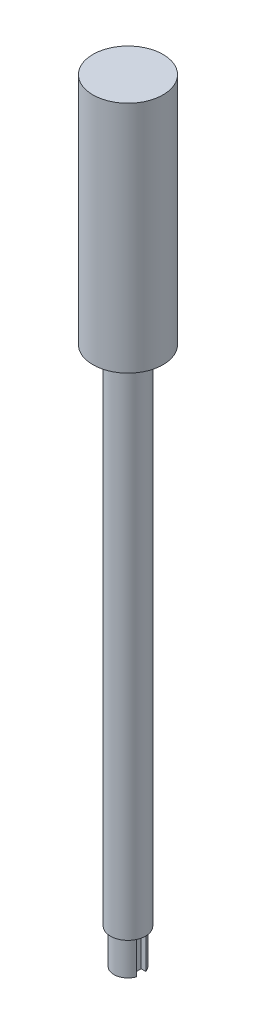
ISO-10303-21;
HEADER;
FILE_DESCRIPTION(('STEP AP214'),'2;1');
FILE_NAME('part.step','',(''),(''),'','','');
FILE_SCHEMA(('AUTOMOTIVE_DESIGN { 1 0 10303 214 1 1 1 1 }'));
ENDSEC;
DATA;
#1=APPLICATION_CONTEXT('core data for automotive mechanical design processes');
#2=APPLICATION_PROTOCOL_DEFINITION('international standard','automotive_design',2000,#1);
#3=PRODUCT_CONTEXT('',#1,'mechanical');
#4=PRODUCT('Part','Part','',(#3));
#5=PRODUCT_RELATED_PRODUCT_CATEGORY('part','',(#4));
#6=PRODUCT_DEFINITION_FORMATION('','',#4);
#7=PRODUCT_DEFINITION_CONTEXT('part definition',#1,'design');
#8=PRODUCT_DEFINITION('design','',#6,#7);
#9=PRODUCT_DEFINITION_SHAPE('','',#8);
#10=(LENGTH_UNIT() NAMED_UNIT(*) SI_UNIT(.MILLI.,.METRE.));
#11=(NAMED_UNIT(*) PLANE_ANGLE_UNIT() SI_UNIT($,.RADIAN.));
#12=(NAMED_UNIT(*) SI_UNIT($,.STERADIAN.) SOLID_ANGLE_UNIT());
#13=UNCERTAINTY_MEASURE_WITH_UNIT(LENGTH_MEASURE(1.E-05),#10,'distance_accuracy_value','');
#14=(GEOMETRIC_REPRESENTATION_CONTEXT(3) GLOBAL_UNCERTAINTY_ASSIGNED_CONTEXT((#13)) GLOBAL_UNIT_ASSIGNED_CONTEXT((#10,
#11,#12)) REPRESENTATION_CONTEXT('',''));
#15=CARTESIAN_POINT('',(0.,0.,0.));
#16=DIRECTION('',(0.,0.,1.));
#17=DIRECTION('',(1.,0.,0.));
#18=AXIS2_PLACEMENT_3D('',#15,#16,#17);
#19=CARTESIAN_POINT('',(0.,215.44,0.));
#20=DIRECTION('',(0.,-1.,0.));
#21=DIRECTION('',(0.,0.,-1.));
#22=AXIS2_PLACEMENT_3D('',#19,#20,#21);
#23=CYLINDRICAL_SURFACE('',#22,7.5);
#24=CARTESIAN_POINT('',(0.,213.44,0.));
#25=DIRECTION('',(0.,1.,0.));
#26=DIRECTION('',(0.,0.,1.));
#27=AXIS2_PLACEMENT_3D('',#24,#25,#26);
#28=CIRCLE('',#27,7.5);
#29=CARTESIAN_POINT('',(0.,213.44,7.5));
#30=VERTEX_POINT('',#29);
#31=EDGE_CURVE('E151',#30,#30,#28,.F.);
#32=ORIENTED_EDGE('',*,*,#31,.T.);
#33=EDGE_LOOP('',(#32));
#34=FACE_BOUND('',#33,.T.);
#35=CARTESIAN_POINT('',(0.,0.,0.));
#36=DIRECTION('',(0.,1.,0.));
#37=DIRECTION('',(0.,0.,1.));
#38=AXIS2_PLACEMENT_3D('',#35,#36,#37);
#39=CIRCLE('',#38,7.5);
#40=CARTESIAN_POINT('',(0.,0.,7.5));
#41=VERTEX_POINT('',#40);
#42=EDGE_CURVE('E139',#41,#41,#39,.T.);
#43=ORIENTED_EDGE('',*,*,#42,.T.);
#44=EDGE_LOOP('',(#43));
#45=FACE_BOUND('',#44,.T.);
#46=ADVANCED_FACE('F44',(#34,#45),#23,.T.);
#47=CARTESIAN_POINT('',(0.,0.,0.));
#48=DIRECTION('',(0.,1.,0.));
#49=DIRECTION('',(0.,0.,1.));
#50=AXIS2_PLACEMENT_3D('',#47,#48,#49);
#51=PLANE('',#50);
#52=DIRECTION('',(1.,0.,0.));
#53=VECTOR('',#52,1.);
#54=CARTESIAN_POINT('',(3.66,0.,-2.));
#55=LINE('',#54,#53);
#56=CARTESIAN_POINT('',(3.66,0.,-2.));
#57=VERTEX_POINT('',#56);
#58=CARTESIAN_POINT('',(5.65685424949238,0.,-2.));
#59=VERTEX_POINT('',#58);
#60=EDGE_CURVE('E89',#57,#59,#55,.T.);
#61=ORIENTED_EDGE('',*,*,#60,.T.);
#62=CARTESIAN_POINT('',(0.,0.,0.));
#63=DIRECTION('',(0.,1.,0.));
#64=DIRECTION('',(0.,0.,1.));
#65=AXIS2_PLACEMENT_3D('',#62,#63,#64);
#66=CIRCLE('',#65,6.);
#67=CARTESIAN_POINT('',(5.65685424949238,0.,2.));
#68=VERTEX_POINT('',#67);
#69=EDGE_CURVE('E54',#68,#59,#66,.F.);
#70=ORIENTED_EDGE('',*,*,#69,.F.);
#71=DIRECTION('',(-1.,0.,0.));
#72=VECTOR('',#71,1.);
#73=CARTESIAN_POINT('',(3.66,0.,2.));
#74=LINE('',#73,#72);
#75=CARTESIAN_POINT('',(3.66,0.,2.));
#76=VERTEX_POINT('',#75);
#77=EDGE_CURVE('E110',#68,#76,#74,.T.);
#78=ORIENTED_EDGE('',*,*,#77,.T.);
#79=DIRECTION('',(0.,0.,-1.));
#80=VECTOR('',#79,1.);
#81=CARTESIAN_POINT('',(3.66,0.,2.));
#82=LINE('',#81,#80);
#83=EDGE_CURVE('E93',#76,#57,#82,.T.);
#84=ORIENTED_EDGE('',*,*,#83,.T.);
#85=EDGE_LOOP('',(#61,#70,#78,#84));
#86=FACE_BOUND('',#85,.T.);
#87=ORIENTED_EDGE('',*,*,#42,.F.);
#88=EDGE_LOOP('',(#87));
#89=FACE_BOUND('',#88,.T.);
#90=ADVANCED_FACE('F161',(#86,#89),#51,.F.);
#91=CARTESIAN_POINT('',(0.,220.44,0.));
#92=DIRECTION('',(0.,-1.,0.));
#93=DIRECTION('',(0.,0.,-1.));
#94=AXIS2_PLACEMENT_3D('',#91,#92,#93);
#95=CYLINDRICAL_SURFACE('',#94,15.);
#96=CARTESIAN_POINT('',(0.,215.44,0.));
#97=DIRECTION('',(0.,1.,0.));
#98=DIRECTION('',(0.,0.,1.));
#99=AXIS2_PLACEMENT_3D('',#96,#97,#98);
#100=CIRCLE('',#99,15.);
#101=CARTESIAN_POINT('',(0.,215.44,15.));
#102=VERTEX_POINT('',#101);
#103=EDGE_CURVE('E135',#102,#102,#100,.T.);
#104=ORIENTED_EDGE('',*,*,#103,.T.);
#105=EDGE_LOOP('',(#104));
#106=FACE_BOUND('',#105,.T.);
#107=CARTESIAN_POINT('',(0.,315.44,0.));
#108=DIRECTION('',(0.,1.,0.));
#109=DIRECTION('',(0.,0.,1.));
#110=AXIS2_PLACEMENT_3D('',#107,#108,#109);
#111=CIRCLE('',#110,15.);
#112=CARTESIAN_POINT('',(0.,315.44,15.));
#113=VERTEX_POINT('',#112);
#114=EDGE_CURVE('E127',#113,#113,#111,.T.);
#115=ORIENTED_EDGE('',*,*,#114,.F.);
#116=EDGE_LOOP('',(#115));
#117=FACE_BOUND('',#116,.T.);
#118=ADVANCED_FACE('F178',(#106,#117),#95,.T.);
#119=CARTESIAN_POINT('',(0.,215.44,0.));
#120=DIRECTION('',(0.,1.,0.));
#121=DIRECTION('',(0.,0.,1.));
#122=AXIS2_PLACEMENT_3D('',#119,#120,#121);
#123=PLANE('',#122);
#124=CARTESIAN_POINT('',(0.,215.44,0.));
#125=DIRECTION('',(0.,1.,0.));
#126=DIRECTION('',(0.,0.,1.));
#127=AXIS2_PLACEMENT_3D('',#124,#125,#126);
#128=CIRCLE('',#127,9.5);
#129=CARTESIAN_POINT('',(0.,215.44,9.5));
#130=VERTEX_POINT('',#129);
#131=EDGE_CURVE('E147',#130,#130,#128,.T.);
#132=ORIENTED_EDGE('',*,*,#131,.T.);
#133=EDGE_LOOP('',(#132));
#134=FACE_BOUND('',#133,.T.);
#135=ORIENTED_EDGE('',*,*,#103,.F.);
#136=EDGE_LOOP('',(#135));
#137=FACE_BOUND('',#136,.T.);
#138=ADVANCED_FACE('F184',(#134,#137),#123,.F.);
#139=CARTESIAN_POINT('',(0.,315.44,0.));
#140=DIRECTION('',(0.,1.,0.));
#141=DIRECTION('',(0.,0.,1.));
#142=AXIS2_PLACEMENT_3D('',#139,#140,#141);
#143=PLANE('',#142);
#144=ORIENTED_EDGE('',*,*,#114,.T.);
#145=EDGE_LOOP('',(#144));
#146=FACE_BOUND('',#145,.T.);
#147=ADVANCED_FACE('F188',(#146),#143,.T.);
#148=CARTESIAN_POINT('',(0.,213.44,0.));
#149=DIRECTION('',(0.,1.,0.));
#150=DIRECTION('',(0.,0.,1.));
#151=AXIS2_PLACEMENT_3D('',#148,#149,#150);
#152=TOROIDAL_SURFACE('',#151,9.5,2.);
#153=ORIENTED_EDGE('',*,*,#31,.F.);
#154=EDGE_LOOP('',(#153));
#155=FACE_BOUND('',#154,.T.);
#156=ORIENTED_EDGE('',*,*,#131,.F.);
#157=EDGE_LOOP('',(#156));
#158=FACE_BOUND('',#157,.T.);
#159=ADVANCED_FACE('F46',(#155,#158),#152,.F.);
#160=CARTESIAN_POINT('',(0.,-15.,0.));
#161=DIRECTION('',(0.,1.,0.));
#162=DIRECTION('',(0.,0.,1.));
#163=AXIS2_PLACEMENT_3D('',#160,#161,#162);
#164=CYLINDRICAL_SURFACE('',#163,6.);
#165=ORIENTED_EDGE('',*,*,#69,.T.);
#166=DIRECTION('',(0.,1.,0.));
#167=VECTOR('',#166,1.);
#168=CARTESIAN_POINT('',(5.65685424949238,-15.,-2.));
#169=LINE('',#168,#167);
#170=CARTESIAN_POINT('',(5.65685424949238,-15.,-2.));
#171=VERTEX_POINT('',#170);
#172=EDGE_CURVE('E122',#59,#171,#169,.F.);
#173=ORIENTED_EDGE('',*,*,#172,.T.);
#174=CARTESIAN_POINT('',(0.,-15.,0.));
#175=DIRECTION('',(0.,-1.,0.));
#176=DIRECTION('',(0.,0.,-1.));
#177=AXIS2_PLACEMENT_3D('',#174,#175,#176);
#178=CIRCLE('',#177,6.);
#179=CARTESIAN_POINT('',(5.65685424949238,-15.,2.));
#180=VERTEX_POINT('',#179);
#181=EDGE_CURVE('E105',#180,#171,#178,.T.);
#182=ORIENTED_EDGE('',*,*,#181,.F.);
#183=DIRECTION('',(0.,1.,0.));
#184=VECTOR('',#183,1.);
#185=CARTESIAN_POINT('',(5.65685424949238,-15.,2.));
#186=LINE('',#185,#184);
#187=EDGE_CURVE('E92',#180,#68,#186,.T.);
#188=ORIENTED_EDGE('',*,*,#187,.T.);
#189=EDGE_LOOP('',(#165,#173,#182,#188));
#190=FACE_BOUND('',#189,.T.);
#191=ADVANCED_FACE('F159',(#190),#164,.T.);
#192=CARTESIAN_POINT('',(0.,-15.,0.));
#193=DIRECTION('',(0.,-1.,0.));
#194=DIRECTION('',(0.,0.,-1.));
#195=AXIS2_PLACEMENT_3D('',#192,#193,#194);
#196=PLANE('',#195);
#197=DIRECTION('',(1.,0.,0.));
#198=VECTOR('',#197,1.);
#199=CARTESIAN_POINT('',(3.66,-15.,-2.));
#200=LINE('',#199,#198);
#201=CARTESIAN_POINT('',(3.66,-15.,-2.));
#202=VERTEX_POINT('',#201);
#203=EDGE_CURVE('E68',#202,#171,#200,.T.);
#204=ORIENTED_EDGE('',*,*,#203,.F.);
#205=DIRECTION('',(0.,0.,-1.));
#206=VECTOR('',#205,1.);
#207=CARTESIAN_POINT('',(3.66,-15.,2.));
#208=LINE('',#207,#206);
#209=CARTESIAN_POINT('',(3.66,-15.,2.));
#210=VERTEX_POINT('',#209);
#211=EDGE_CURVE('E96',#210,#202,#208,.T.);
#212=ORIENTED_EDGE('',*,*,#211,.F.);
#213=DIRECTION('',(-1.,0.,0.));
#214=VECTOR('',#213,1.);
#215=CARTESIAN_POINT('',(0.,-15.,2.));
#216=LINE('',#215,#214);
#217=EDGE_CURVE('E11',#180,#210,#216,.T.);
#218=ORIENTED_EDGE('',*,*,#217,.F.);
#219=ORIENTED_EDGE('',*,*,#181,.T.);
#220=EDGE_LOOP('',(#204,#212,#218,#219));
#221=FACE_BOUND('',#220,.T.);
#222=ADVANCED_FACE('F103',(#221),#196,.T.);
#223=CARTESIAN_POINT('',(3.66,15.8077551029626,-2.));
#224=DIRECTION('',(0.,0.,-1.));
#225=DIRECTION('',(-1.,0.,0.));
#226=AXIS2_PLACEMENT_3D('',#223,#224,#225);
#227=PLANE('',#226);
#228=ORIENTED_EDGE('',*,*,#60,.F.);
#229=DIRECTION('',(0.,-1.,0.));
#230=VECTOR('',#229,1.);
#231=CARTESIAN_POINT('',(3.66,15.8077551029626,-2.));
#232=LINE('',#231,#230);
#233=EDGE_CURVE('E86',#57,#202,#232,.T.);
#234=ORIENTED_EDGE('',*,*,#233,.T.);
#235=ORIENTED_EDGE('',*,*,#203,.T.);
#236=ORIENTED_EDGE('',*,*,#172,.F.);
#237=EDGE_LOOP('',(#228,#234,#235,#236));
#238=FACE_BOUND('',#237,.T.);
#239=ADVANCED_FACE('F87',(#238),#227,.F.);
#240=CARTESIAN_POINT('',(3.66,15.8077551029626,2.));
#241=DIRECTION('',(0.,0.,1.));
#242=DIRECTION('',(1.,0.,0.));
#243=AXIS2_PLACEMENT_3D('',#240,#241,#242);
#244=PLANE('',#243);
#245=ORIENTED_EDGE('',*,*,#217,.T.);
#246=DIRECTION('',(0.,-1.,0.));
#247=VECTOR('',#246,1.);
#248=CARTESIAN_POINT('',(3.66,15.8077551029626,2.));
#249=LINE('',#248,#247);
#250=EDGE_CURVE('E61',#76,#210,#249,.T.);
#251=ORIENTED_EDGE('',*,*,#250,.F.);
#252=ORIENTED_EDGE('',*,*,#77,.F.);
#253=ORIENTED_EDGE('',*,*,#187,.F.);
#254=EDGE_LOOP('',(#245,#251,#252,#253));
#255=FACE_BOUND('',#254,.T.);
#256=ADVANCED_FACE('F164',(#255),#244,.F.);
#257=CARTESIAN_POINT('',(3.66,15.8077551029626,2.));
#258=DIRECTION('',(-1.,0.,0.));
#259=DIRECTION('',(0.,0.,1.));
#260=AXIS2_PLACEMENT_3D('',#257,#258,#259);
#261=PLANE('',#260);
#262=ORIENTED_EDGE('',*,*,#250,.T.);
#263=ORIENTED_EDGE('',*,*,#211,.T.);
#264=ORIENTED_EDGE('',*,*,#233,.F.);
#265=ORIENTED_EDGE('',*,*,#83,.F.);
#266=EDGE_LOOP('',(#262,#263,#264,#265));
#267=FACE_BOUND('',#266,.T.);
#268=ADVANCED_FACE('F97',(#267),#261,.F.);
#269=CLOSED_SHELL('',(#46,#90,#118,#138,#147,#159,#191,#222,#239,#256,#268));
#270=CARTESIAN_POINT('',(0.,220.44,0.));
#271=DIRECTION('',(0.,1.,0.));
#272=DIRECTION('',(0.,0.,1.));
#273=AXIS2_PLACEMENT_3D('',#270,#271,#272);
#274=PLANE('',#273);
#275=CARTESIAN_POINT('',(0.,220.44,0.));
#276=DIRECTION('',(0.,1.,0.));
#277=DIRECTION('',(0.,0.,1.));
#278=AXIS2_PLACEMENT_3D('',#275,#276,#277);
#279=CIRCLE('',#278,12.5);
#280=CARTESIAN_POINT('',(0.,220.44,-12.5));
#281=VERTEX_POINT('',#280);
#282=EDGE_CURVE('E143',#281,#281,#279,.F.);
#283=ORIENTED_EDGE('',*,*,#282,.F.);
#284=EDGE_LOOP('',(#283));
#285=FACE_BOUND('',#284,.T.);
#286=ADVANCED_FACE('F190',(#285),#274,.T.);
#287=CARTESIAN_POINT('',(0.,310.44,0.));
#288=DIRECTION('',(0.,-1.,0.));
#289=DIRECTION('',(0.,0.,-1.));
#290=AXIS2_PLACEMENT_3D('',#287,#288,#289);
#291=CYLINDRICAL_SURFACE('',#290,12.5);
#292=CARTESIAN_POINT('',(0.,310.44,0.));
#293=DIRECTION('',(0.,1.,0.));
#294=DIRECTION('',(0.,0.,1.));
#295=AXIS2_PLACEMENT_3D('',#292,#293,#294);
#296=CIRCLE('',#295,12.5);
#297=CARTESIAN_POINT('',(0.,310.44,-12.5));
#298=VERTEX_POINT('',#297);
#299=EDGE_CURVE('E131',#298,#298,#296,.T.);
#300=CARTESIAN_POINT('',(0.,310.44,-12.5));
#301=CARTESIAN_POINT('',(0.,309.5025,-12.5));
#302=CARTESIAN_POINT('',(0.,308.565,-12.5));
#303=CARTESIAN_POINT('',(0.,306.69,-12.5));
#304=CARTESIAN_POINT('',(0.,305.7525,-12.5));
#305=CARTESIAN_POINT('',(0.,303.8775,-12.5));
#306=CARTESIAN_POINT('',(0.,302.94,-12.5));
#307=CARTESIAN_POINT('',(0.,301.065,-12.5));
#308=CARTESIAN_POINT('',(0.,300.1275,-12.5));
#309=CARTESIAN_POINT('',(0.,298.2525,-12.5));
#310=CARTESIAN_POINT('',(0.,297.315,-12.5));
#311=CARTESIAN_POINT('',(0.,295.44,-12.5));
#312=CARTESIAN_POINT('',(0.,294.5025,-12.5));
#313=CARTESIAN_POINT('',(0.,292.6275,-12.5));
#314=CARTESIAN_POINT('',(0.,291.69,-12.5));
#315=CARTESIAN_POINT('',(0.,289.815,-12.5));
#316=CARTESIAN_POINT('',(0.,288.8775,-12.5));
#317=CARTESIAN_POINT('',(0.,287.0025,-12.5));
#318=CARTESIAN_POINT('',(0.,286.065,-12.5));
#319=CARTESIAN_POINT('',(0.,284.19,-12.5));
#320=CARTESIAN_POINT('',(0.,283.2525,-12.5));
#321=CARTESIAN_POINT('',(0.,281.3775,-12.5));
#322=CARTESIAN_POINT('',(0.,280.44,-12.5));
#323=CARTESIAN_POINT('',(0.,278.565,-12.5));
#324=CARTESIAN_POINT('',(0.,277.6275,-12.5));
#325=CARTESIAN_POINT('',(0.,275.7525,-12.5));
#326=CARTESIAN_POINT('',(0.,274.815,-12.5));
#327=CARTESIAN_POINT('',(0.,272.94,-12.5));
#328=CARTESIAN_POINT('',(0.,272.0025,-12.5));
#329=CARTESIAN_POINT('',(0.,270.1275,-12.5));
#330=CARTESIAN_POINT('',(0.,269.19,-12.5));
#331=CARTESIAN_POINT('',(0.,267.315,-12.5));
#332=CARTESIAN_POINT('',(0.,266.3775,-12.5));
#333=CARTESIAN_POINT('',(0.,264.5025,-12.5));
#334=CARTESIAN_POINT('',(0.,263.565,-12.5));
#335=CARTESIAN_POINT('',(0.,261.69,-12.5));
#336=CARTESIAN_POINT('',(0.,260.7525,-12.5));
#337=CARTESIAN_POINT('',(0.,258.8775,-12.5));
#338=CARTESIAN_POINT('',(0.,257.94,-12.5));
#339=CARTESIAN_POINT('',(0.,256.065,-12.5));
#340=CARTESIAN_POINT('',(0.,255.1275,-12.5));
#341=CARTESIAN_POINT('',(0.,253.2525,-12.5));
#342=CARTESIAN_POINT('',(0.,252.315,-12.5));
#343=CARTESIAN_POINT('',(0.,250.44,-12.5));
#344=CARTESIAN_POINT('',(0.,249.5025,-12.5));
#345=CARTESIAN_POINT('',(0.,247.6275,-12.5));
#346=CARTESIAN_POINT('',(0.,246.69,-12.5));
#347=CARTESIAN_POINT('',(0.,244.815,-12.5));
#348=CARTESIAN_POINT('',(0.,243.8775,-12.5));
#349=CARTESIAN_POINT('',(0.,242.0025,-12.5));
#350=CARTESIAN_POINT('',(0.,241.065,-12.5));
#351=CARTESIAN_POINT('',(0.,239.19,-12.5));
#352=CARTESIAN_POINT('',(0.,238.2525,-12.5));
#353=CARTESIAN_POINT('',(0.,236.3775,-12.5));
#354=CARTESIAN_POINT('',(0.,235.44,-12.5));
#355=CARTESIAN_POINT('',(0.,233.565,-12.5));
#356=CARTESIAN_POINT('',(0.,232.6275,-12.5));
#357=CARTESIAN_POINT('',(0.,230.7525,-12.5));
#358=CARTESIAN_POINT('',(0.,229.815,-12.5));
#359=CARTESIAN_POINT('',(0.,227.94,-12.5));
#360=CARTESIAN_POINT('',(0.,227.0025,-12.5));
#361=CARTESIAN_POINT('',(0.,225.1275,-12.5));
#362=CARTESIAN_POINT('',(0.,224.19,-12.5));
#363=CARTESIAN_POINT('',(0.,222.315,-12.5));
#364=CARTESIAN_POINT('',(0.,221.3775,-12.5));
#365=CARTESIAN_POINT('',(0.,220.44,-12.5));
#366=B_SPLINE_CURVE_WITH_KNOTS('',3,(#300,#301,#302,#303,#304,#305,#306,#307,#308,#309,#310,
#311,#312,#313,#314,#315,#316,#317,#318,#319,#320,#321,#322,#323,#324,#325,#326,#327,#328,#329,
#330,#331,#332,#333,#334,#335,#336,#337,#338,#339,#340,#341,#342,#343,#344,#345,#346,#347,#348,
#349,#350,#351,#352,#353,#354,#355,#356,#357,#358,#359,#360,#361,#362,#363,#364,#365),
.UNSPECIFIED.,.F.,.F.,(4,2,2,2,2,2,2,2,2,2,2,2,2,2,2,2,2,2,2,2,2,2,2,2,2,2,2,2,2,2,2,2,4),(0.,
2.81250000000005,5.62500000000005,8.43750000000004,11.25,14.0625,16.875,19.6875,22.5,25.3125,
28.125,30.9375,33.75,36.5625,39.375,42.1875,45.,47.8125,50.625,53.4375,56.25,59.0625,61.875,
64.6875,67.5,70.3125,73.125,75.9375,78.75,81.5625,84.375,87.1875,90.),.UNSPECIFIED.);
#367=EDGE_CURVE('BSEAM193',#298,#281,#366,.T.);
#368=ORIENTED_EDGE('',*,*,#299,.T.);
#369=ORIENTED_EDGE('',*,*,#282,.T.);
#370=ORIENTED_EDGE('',*,*,#367,.T.);
#371=ORIENTED_EDGE('',*,*,#367,.F.);
#372=EDGE_LOOP('',(#368,#370,#369,#371));
#373=FACE_BOUND('',#372,.T.);
#374=ADVANCED_FACE('F193',(#373),#291,.F.);
#375=CARTESIAN_POINT('',(0.,310.44,0.));
#376=DIRECTION('',(0.,1.,0.));
#377=DIRECTION('',(0.,0.,1.));
#378=AXIS2_PLACEMENT_3D('',#375,#376,#377);
#379=PLANE('',#378);
#380=ORIENTED_EDGE('',*,*,#299,.F.);
#381=EDGE_LOOP('',(#380));
#382=FACE_BOUND('',#381,.T.);
#383=ADVANCED_FACE('F198',(#382),#379,.F.);
#384=CLOSED_SHELL('',(#286,#374,#383));
#385=ORIENTED_CLOSED_SHELL('',*,#384,.T.);
#386=BREP_WITH_VOIDS('B2',#269,(#385));
#387=ADVANCED_BREP_SHAPE_REPRESENTATION('',(#18,#386),#14);
#388=SHAPE_DEFINITION_REPRESENTATION(#9,#387);
ENDSEC;
END-ISO-10303-21;
